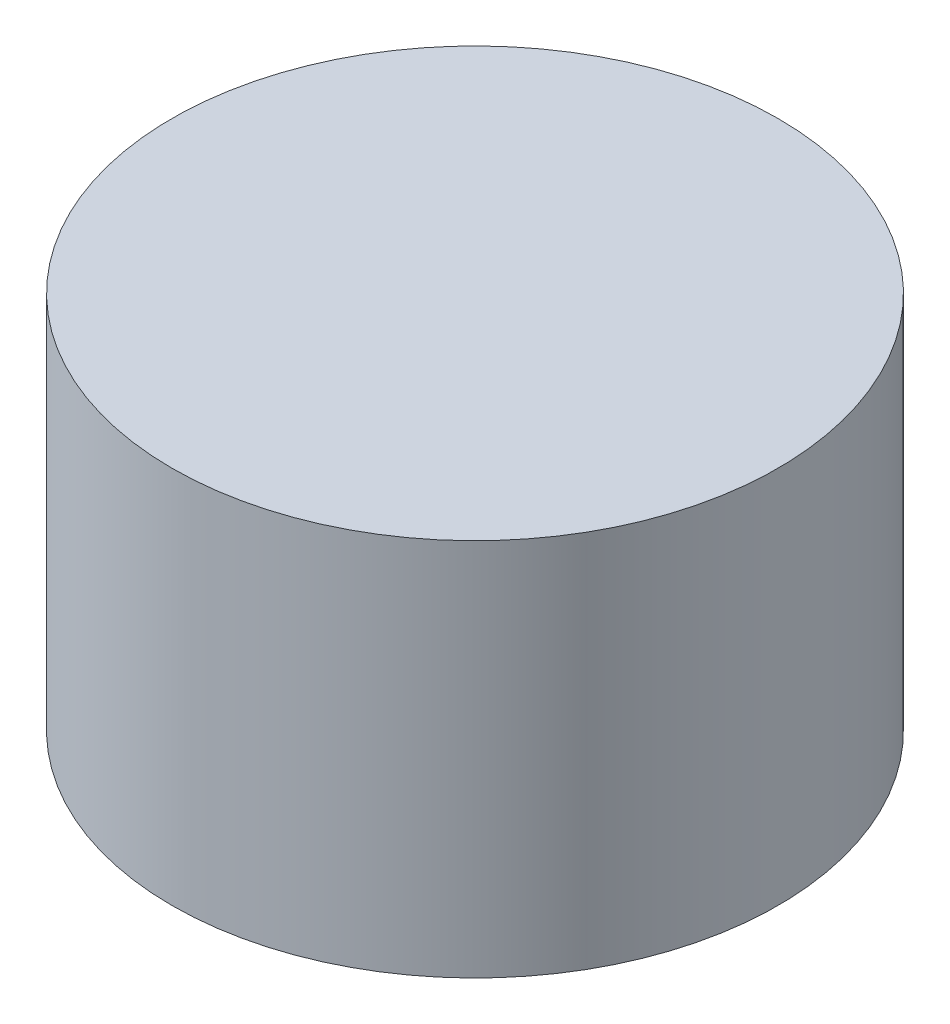
ISO-10303-21;
HEADER;
FILE_DESCRIPTION(('STEP AP214'),'2;1');
FILE_NAME('part.step','',(''),(''),'','','');
FILE_SCHEMA(('AUTOMOTIVE_DESIGN { 1 0 10303 214 1 1 1 1 }'));
ENDSEC;
DATA;
#1=APPLICATION_CONTEXT('core data for automotive mechanical design processes');
#2=APPLICATION_PROTOCOL_DEFINITION('international standard','automotive_design',2000,#1);
#3=PRODUCT_CONTEXT('',#1,'mechanical');
#4=PRODUCT('Part','Part','',(#3));
#5=PRODUCT_RELATED_PRODUCT_CATEGORY('part','',(#4));
#6=PRODUCT_DEFINITION_FORMATION('','',#4);
#7=PRODUCT_DEFINITION_CONTEXT('part definition',#1,'design');
#8=PRODUCT_DEFINITION('design','',#6,#7);
#9=PRODUCT_DEFINITION_SHAPE('','',#8);
#10=(LENGTH_UNIT() NAMED_UNIT(*) SI_UNIT(.MILLI.,.METRE.));
#11=(NAMED_UNIT(*) PLANE_ANGLE_UNIT() SI_UNIT($,.RADIAN.));
#12=(NAMED_UNIT(*) SI_UNIT($,.STERADIAN.) SOLID_ANGLE_UNIT());
#13=UNCERTAINTY_MEASURE_WITH_UNIT(LENGTH_MEASURE(1.E-05),#10,'distance_accuracy_value','');
#14=(GEOMETRIC_REPRESENTATION_CONTEXT(3) GLOBAL_UNCERTAINTY_ASSIGNED_CONTEXT((#13)) GLOBAL_UNIT_ASSIGNED_CONTEXT((#10,
#11,#12)) REPRESENTATION_CONTEXT('',''));
#15=CARTESIAN_POINT('',(0.,0.,0.));
#16=DIRECTION('',(0.,0.,1.));
#17=DIRECTION('',(1.,0.,0.));
#18=AXIS2_PLACEMENT_3D('',#15,#16,#17);
#19=CARTESIAN_POINT('',(0.,5.,0.));
#20=DIRECTION('',(0.,-1.,0.));
#21=DIRECTION('',(0.,0.,-1.));
#22=AXIS2_PLACEMENT_3D('',#19,#20,#21);
#23=CYLINDRICAL_SURFACE('',#22,4.);
#24=CARTESIAN_POINT('',(0.,5.,0.));
#25=DIRECTION('',(0.,1.,0.));
#26=DIRECTION('',(0.,0.,1.));
#27=AXIS2_PLACEMENT_3D('',#24,#25,#26);
#28=CIRCLE('',#27,4.);
#29=CARTESIAN_POINT('',(0.,5.,4.));
#30=VERTEX_POINT('',#29);
#31=EDGE_CURVE('E10',#30,#30,#28,.T.);
#32=ORIENTED_EDGE('',*,*,#31,.F.);
#33=EDGE_LOOP('',(#32));
#34=FACE_BOUND('',#33,.T.);
#35=CARTESIAN_POINT('',(0.,0.,0.));
#36=DIRECTION('',(0.,1.,0.));
#37=DIRECTION('',(0.,0.,1.));
#38=AXIS2_PLACEMENT_3D('',#35,#36,#37);
#39=CIRCLE('',#38,4.);
#40=CARTESIAN_POINT('',(0.,0.,4.));
#41=VERTEX_POINT('',#40);
#42=EDGE_CURVE('E46',#41,#41,#39,.T.);
#43=ORIENTED_EDGE('',*,*,#42,.T.);
#44=EDGE_LOOP('',(#43));
#45=FACE_BOUND('',#44,.T.);
#46=ADVANCED_FACE('F43',(#34,#45),#23,.T.);
#47=CARTESIAN_POINT('',(0.,5.,0.));
#48=DIRECTION('',(0.,1.,0.));
#49=DIRECTION('',(0.,0.,1.));
#50=AXIS2_PLACEMENT_3D('',#47,#48,#49);
#51=PLANE('',#50);
#52=ORIENTED_EDGE('',*,*,#31,.T.);
#53=EDGE_LOOP('',(#52));
#54=FACE_BOUND('',#53,.T.);
#55=ADVANCED_FACE('F60',(#54),#51,.T.);
#56=CARTESIAN_POINT('',(0.,0.,0.));
#57=DIRECTION('',(0.,1.,0.));
#58=DIRECTION('',(0.,0.,1.));
#59=AXIS2_PLACEMENT_3D('',#56,#57,#58);
#60=PLANE('',#59);
#61=ORIENTED_EDGE('',*,*,#42,.F.);
#62=EDGE_LOOP('',(#61));
#63=FACE_BOUND('',#62,.T.);
#64=ADVANCED_FACE('F58',(#63),#60,.F.);
#65=CLOSED_SHELL('',(#46,#55,#64));
#66=MANIFOLD_SOLID_BREP('B2',#65);
#67=ADVANCED_BREP_SHAPE_REPRESENTATION('',(#18,#66),#14);
#68=SHAPE_DEFINITION_REPRESENTATION(#9,#67);
ENDSEC;
END-ISO-10303-21;
